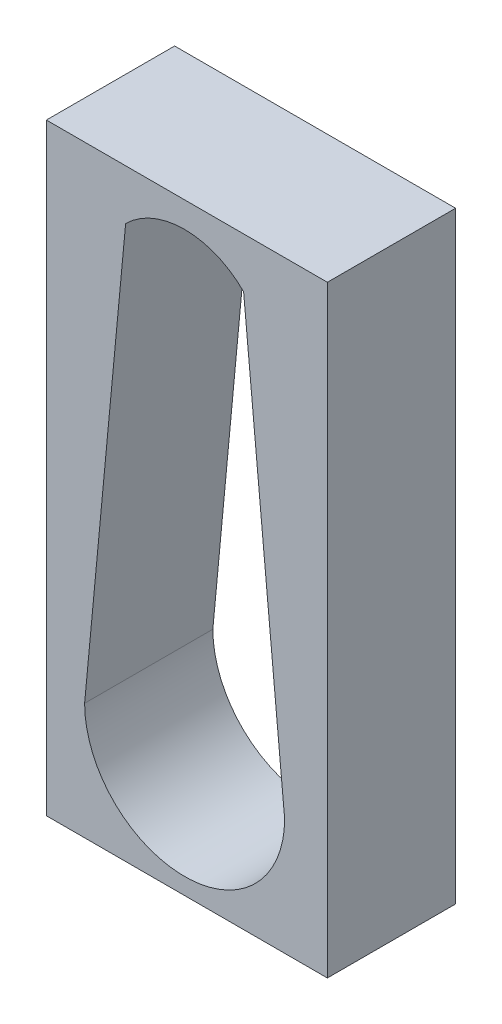
ISO-10303-21;
HEADER;
FILE_DESCRIPTION(('STEP AP214'),'2;1');
FILE_NAME('part.step','',(''),(''),'','','');
FILE_SCHEMA(('AUTOMOTIVE_DESIGN { 1 0 10303 214 1 1 1 1 }'));
ENDSEC;
DATA;
#1=APPLICATION_CONTEXT('core data for automotive mechanical design processes');
#2=APPLICATION_PROTOCOL_DEFINITION('international standard','automotive_design',2000,#1);
#3=PRODUCT_CONTEXT('',#1,'mechanical');
#4=PRODUCT('Part','Part','',(#3));
#5=PRODUCT_RELATED_PRODUCT_CATEGORY('part','',(#4));
#6=PRODUCT_DEFINITION_FORMATION('','',#4);
#7=PRODUCT_DEFINITION_CONTEXT('part definition',#1,'design');
#8=PRODUCT_DEFINITION('design','',#6,#7);
#9=PRODUCT_DEFINITION_SHAPE('','',#8);
#10=(LENGTH_UNIT() NAMED_UNIT(*) SI_UNIT(.MILLI.,.METRE.));
#11=(NAMED_UNIT(*) PLANE_ANGLE_UNIT() SI_UNIT($,.RADIAN.));
#12=(NAMED_UNIT(*) SI_UNIT($,.STERADIAN.) SOLID_ANGLE_UNIT());
#13=UNCERTAINTY_MEASURE_WITH_UNIT(LENGTH_MEASURE(1.E-05),#10,'distance_accuracy_value','');
#14=(GEOMETRIC_REPRESENTATION_CONTEXT(3) GLOBAL_UNCERTAINTY_ASSIGNED_CONTEXT((#13)) GLOBAL_UNIT_ASSIGNED_CONTEXT((#10,
#11,#12)) REPRESENTATION_CONTEXT('',''));
#15=CARTESIAN_POINT('',(0.,0.,0.));
#16=DIRECTION('',(0.,0.,1.));
#17=DIRECTION('',(1.,0.,0.));
#18=AXIS2_PLACEMENT_3D('',#15,#16,#17);
#19=CARTESIAN_POINT('',(0.,0.,5.));
#20=DIRECTION('',(0.,0.,1.));
#21=DIRECTION('',(1.,0.,0.));
#22=AXIS2_PLACEMENT_3D('',#19,#20,#21);
#23=PLANE('',#22);
#24=DIRECTION('',(0.,-1.,0.));
#25=VECTOR('',#24,1.);
#26=CARTESIAN_POINT('',(-5.39006600771874,18.9510857556661,5.));
#27=LINE('',#26,#25);
#28=CARTESIAN_POINT('',(-5.39006600771874,18.9510857556661,5.));
#29=VERTEX_POINT('',#28);
#30=CARTESIAN_POINT('',(-5.39006600771874,-4.54399738258899,5.));
#31=VERTEX_POINT('',#30);
#32=EDGE_CURVE('E159',#29,#31,#27,.T.);
#33=ORIENTED_EDGE('',*,*,#32,.T.);
#34=DIRECTION('',(1.,0.,0.));
#35=VECTOR('',#34,1.);
#36=CARTESIAN_POINT('',(-5.39006600771874,-4.54399738258899,5.));
#37=LINE('',#36,#35);
#38=CARTESIAN_POINT('',(5.56642690625399,-4.54399738258899,5.));
#39=VERTEX_POINT('',#38);
#40=EDGE_CURVE('E163',#31,#39,#37,.T.);
#41=ORIENTED_EDGE('',*,*,#40,.T.);
#42=DIRECTION('',(0.,1.,0.));
#43=VECTOR('',#42,1.);
#44=CARTESIAN_POINT('',(5.56642690625399,18.9510857556661,5.));
#45=LINE('',#44,#43);
#46=CARTESIAN_POINT('',(5.56642690625399,18.9510857556661,5.));
#47=VERTEX_POINT('',#46);
#48=EDGE_CURVE('E167',#39,#47,#45,.T.);
#49=ORIENTED_EDGE('',*,*,#48,.T.);
#50=DIRECTION('',(-1.,0.,0.));
#51=VECTOR('',#50,1.);
#52=CARTESIAN_POINT('',(-5.39006600771874,18.9510857556661,5.));
#53=LINE('',#52,#51);
#54=EDGE_CURVE('E170',#47,#29,#53,.T.);
#55=ORIENTED_EDGE('',*,*,#54,.T.);
#56=EDGE_LOOP('',(#33,#41,#49,#55));
#57=FACE_BOUND('',#56,.T.);
#58=DIRECTION('',(-0.0937035429320522,0.995600143653054,0.));
#59=VECTOR('',#58,1.);
#60=CARTESIAN_POINT('',(3.9,0.,5.));
#61=LINE('',#60,#59);
#62=CARTESIAN_POINT('',(3.9,0.,5.));
#63=VERTEX_POINT('',#62);
#64=CARTESIAN_POINT('',(2.3,17.,5.));
#65=VERTEX_POINT('',#64);
#66=EDGE_CURVE('E120',#63,#65,#61,.T.);
#67=ORIENTED_EDGE('',*,*,#66,.F.);
#68=CARTESIAN_POINT('',(0.,0.,5.));
#69=DIRECTION('',(0.,0.,1.));
#70=DIRECTION('',(1.,0.,0.));
#71=AXIS2_PLACEMENT_3D('',#68,#69,#70);
#72=CIRCLE('',#71,3.9);
#73=CARTESIAN_POINT('',(-3.9,0.,5.));
#74=VERTEX_POINT('',#73);
#75=EDGE_CURVE('E111',#74,#63,#72,.T.);
#76=ORIENTED_EDGE('',*,*,#75,.F.);
#77=DIRECTION('',(-0.0937035429320521,-0.995600143653054,0.));
#78=VECTOR('',#77,1.);
#79=CARTESIAN_POINT('',(-3.9,0.,5.));
#80=LINE('',#79,#78);
#81=CARTESIAN_POINT('',(-2.3,17.,5.));
#82=VERTEX_POINT('',#81);
#83=EDGE_CURVE('E137',#82,#74,#80,.T.);
#84=ORIENTED_EDGE('',*,*,#83,.F.);
#85=CARTESIAN_POINT('',(0.,14.7,5.));
#86=DIRECTION('',(0.,0.,1.));
#87=DIRECTION('',(-1.,0.,0.));
#88=AXIS2_PLACEMENT_3D('',#85,#86,#87);
#89=CIRCLE('',#88,3.25269119345812);
#90=EDGE_CURVE('E133',#65,#82,#89,.T.);
#91=ORIENTED_EDGE('',*,*,#90,.F.);
#92=EDGE_LOOP('',(#67,#76,#84,#91));
#93=FACE_BOUND('',#92,.T.);
#94=ADVANCED_FACE('F45',(#57,#93),#23,.T.);
#95=CARTESIAN_POINT('',(0.,0.,0.));
#96=DIRECTION('',(0.,0.,1.));
#97=DIRECTION('',(1.,0.,0.));
#98=AXIS2_PLACEMENT_3D('',#95,#96,#97);
#99=PLANE('',#98);
#100=DIRECTION('',(0.,-1.,0.));
#101=VECTOR('',#100,1.);
#102=CARTESIAN_POINT('',(-5.39006600771874,18.9510857556661,0.));
#103=LINE('',#102,#101);
#104=CARTESIAN_POINT('',(-5.39006600771874,18.9510857556661,0.));
#105=VERTEX_POINT('',#104);
#106=CARTESIAN_POINT('',(-5.39006600771874,-4.54399738258899,0.));
#107=VERTEX_POINT('',#106);
#108=EDGE_CURVE('E129',#105,#107,#103,.T.);
#109=ORIENTED_EDGE('',*,*,#108,.F.);
#110=DIRECTION('',(-1.,0.,0.));
#111=VECTOR('',#110,1.);
#112=CARTESIAN_POINT('',(-5.39006600771874,18.9510857556661,0.));
#113=LINE('',#112,#111);
#114=CARTESIAN_POINT('',(5.56642690625399,18.9510857556661,0.));
#115=VERTEX_POINT('',#114);
#116=EDGE_CURVE('E164',#115,#105,#113,.T.);
#117=ORIENTED_EDGE('',*,*,#116,.F.);
#118=DIRECTION('',(0.,1.,0.));
#119=VECTOR('',#118,1.);
#120=CARTESIAN_POINT('',(5.56642690625399,18.9510857556661,0.));
#121=LINE('',#120,#119);
#122=CARTESIAN_POINT('',(5.56642690625399,-4.54399738258899,0.));
#123=VERTEX_POINT('',#122);
#124=EDGE_CURVE('E180',#123,#115,#121,.T.);
#125=ORIENTED_EDGE('',*,*,#124,.F.);
#126=DIRECTION('',(1.,0.,0.));
#127=VECTOR('',#126,1.);
#128=CARTESIAN_POINT('',(-5.39006600771874,-4.54399738258899,0.));
#129=LINE('',#128,#127);
#130=EDGE_CURVE('E177',#107,#123,#129,.T.);
#131=ORIENTED_EDGE('',*,*,#130,.F.);
#132=EDGE_LOOP('',(#109,#117,#125,#131));
#133=FACE_BOUND('',#132,.T.);
#134=CARTESIAN_POINT('',(0.,0.,0.));
#135=DIRECTION('',(0.,0.,1.));
#136=DIRECTION('',(1.,0.,0.));
#137=AXIS2_PLACEMENT_3D('',#134,#135,#136);
#138=CIRCLE('',#137,3.9);
#139=CARTESIAN_POINT('',(-3.9,0.,0.));
#140=VERTEX_POINT('',#139);
#141=CARTESIAN_POINT('',(3.9,0.,0.));
#142=VERTEX_POINT('',#141);
#143=EDGE_CURVE('E69',#140,#142,#138,.T.);
#144=ORIENTED_EDGE('',*,*,#143,.T.);
#145=DIRECTION('',(-0.0937035429320522,0.995600143653054,0.));
#146=VECTOR('',#145,1.);
#147=CARTESIAN_POINT('',(3.9,0.,0.));
#148=LINE('',#147,#146);
#149=CARTESIAN_POINT('',(2.3,17.,0.));
#150=VERTEX_POINT('',#149);
#151=EDGE_CURVE('E127',#142,#150,#148,.T.);
#152=ORIENTED_EDGE('',*,*,#151,.T.);
#153=CARTESIAN_POINT('',(0.,14.7,0.));
#154=DIRECTION('',(0.,0.,1.));
#155=DIRECTION('',(-1.,0.,0.));
#156=AXIS2_PLACEMENT_3D('',#153,#154,#155);
#157=CIRCLE('',#156,3.25269119345812);
#158=CARTESIAN_POINT('',(-2.3,17.,0.));
#159=VERTEX_POINT('',#158);
#160=EDGE_CURVE('E146',#150,#159,#157,.T.);
#161=ORIENTED_EDGE('',*,*,#160,.T.);
#162=DIRECTION('',(-0.0937035429320521,-0.995600143653054,0.));
#163=VECTOR('',#162,1.);
#164=CARTESIAN_POINT('',(-3.9,0.,0.));
#165=LINE('',#164,#163);
#166=EDGE_CURVE('E121',#159,#140,#165,.T.);
#167=ORIENTED_EDGE('',*,*,#166,.T.);
#168=EDGE_LOOP('',(#144,#152,#161,#167));
#169=FACE_BOUND('',#168,.T.);
#170=ADVANCED_FACE('F203',(#133,#169),#99,.F.);
#171=CARTESIAN_POINT('',(-5.39006600771874,18.9510857556661,5.));
#172=DIRECTION('',(1.,0.,0.));
#173=DIRECTION('',(0.,0.,-1.));
#174=AXIS2_PLACEMENT_3D('',#171,#172,#173);
#175=PLANE('',#174);
#176=ORIENTED_EDGE('',*,*,#108,.T.);
#177=DIRECTION('',(0.,0.,-1.));
#178=VECTOR('',#177,1.);
#179=CARTESIAN_POINT('',(-5.39006600771874,-4.54399738258899,5.));
#180=LINE('',#179,#178);
#181=EDGE_CURVE('E11',#31,#107,#180,.T.);
#182=ORIENTED_EDGE('',*,*,#181,.F.);
#183=ORIENTED_EDGE('',*,*,#32,.F.);
#184=DIRECTION('',(0.,0.,-1.));
#185=VECTOR('',#184,1.);
#186=CARTESIAN_POINT('',(-5.39006600771874,18.9510857556661,5.));
#187=LINE('',#186,#185);
#188=EDGE_CURVE('E173',#29,#105,#187,.T.);
#189=ORIENTED_EDGE('',*,*,#188,.T.);
#190=EDGE_LOOP('',(#176,#182,#183,#189));
#191=FACE_BOUND('',#190,.T.);
#192=ADVANCED_FACE('F47',(#191),#175,.F.);
#193=CARTESIAN_POINT('',(-5.39006600771874,-4.54399738258899,5.));
#194=DIRECTION('',(0.,1.,0.));
#195=DIRECTION('',(0.,0.,1.));
#196=AXIS2_PLACEMENT_3D('',#193,#194,#195);
#197=PLANE('',#196);
#198=ORIENTED_EDGE('',*,*,#130,.T.);
#199=DIRECTION('',(0.,0.,-1.));
#200=VECTOR('',#199,1.);
#201=CARTESIAN_POINT('',(5.56642690625399,-4.54399738258899,5.));
#202=LINE('',#201,#200);
#203=EDGE_CURVE('E54',#39,#123,#202,.T.);
#204=ORIENTED_EDGE('',*,*,#203,.F.);
#205=ORIENTED_EDGE('',*,*,#40,.F.);
#206=ORIENTED_EDGE('',*,*,#181,.T.);
#207=EDGE_LOOP('',(#198,#204,#205,#206));
#208=FACE_BOUND('',#207,.T.);
#209=ADVANCED_FACE('F213',(#208),#197,.F.);
#210=CARTESIAN_POINT('',(5.56642690625399,18.9510857556661,5.));
#211=DIRECTION('',(-1.,0.,0.));
#212=DIRECTION('',(0.,0.,1.));
#213=AXIS2_PLACEMENT_3D('',#210,#211,#212);
#214=PLANE('',#213);
#215=ORIENTED_EDGE('',*,*,#124,.T.);
#216=DIRECTION('',(0.,0.,-1.));
#217=VECTOR('',#216,1.);
#218=CARTESIAN_POINT('',(5.56642690625399,18.9510857556661,5.));
#219=LINE('',#218,#217);
#220=EDGE_CURVE('E188',#47,#115,#219,.T.);
#221=ORIENTED_EDGE('',*,*,#220,.F.);
#222=ORIENTED_EDGE('',*,*,#48,.F.);
#223=ORIENTED_EDGE('',*,*,#203,.T.);
#224=EDGE_LOOP('',(#215,#221,#222,#223));
#225=FACE_BOUND('',#224,.T.);
#226=ADVANCED_FACE('F197',(#225),#214,.F.);
#227=CARTESIAN_POINT('',(-5.39006600771874,18.9510857556661,5.));
#228=DIRECTION('',(0.,-1.,0.));
#229=DIRECTION('',(0.,0.,-1.));
#230=AXIS2_PLACEMENT_3D('',#227,#228,#229);
#231=PLANE('',#230);
#232=ORIENTED_EDGE('',*,*,#116,.T.);
#233=ORIENTED_EDGE('',*,*,#188,.F.);
#234=ORIENTED_EDGE('',*,*,#54,.F.);
#235=ORIENTED_EDGE('',*,*,#220,.T.);
#236=EDGE_LOOP('',(#232,#233,#234,#235));
#237=FACE_BOUND('',#236,.T.);
#238=ADVANCED_FACE('F207',(#237),#231,.F.);
#239=CARTESIAN_POINT('',(0.,0.,5.));
#240=DIRECTION('',(0.,0.,-1.));
#241=DIRECTION('',(-1.,0.,0.));
#242=AXIS2_PLACEMENT_3D('',#239,#240,#241);
#243=CYLINDRICAL_SURFACE('',#242,3.9);
#244=ORIENTED_EDGE('',*,*,#143,.F.);
#245=DIRECTION('',(0.,0.,-1.));
#246=VECTOR('',#245,1.);
#247=CARTESIAN_POINT('',(-3.9,0.,5.));
#248=LINE('',#247,#246);
#249=EDGE_CURVE('E115',#74,#140,#248,.T.);
#250=ORIENTED_EDGE('',*,*,#249,.F.);
#251=ORIENTED_EDGE('',*,*,#75,.T.);
#252=DIRECTION('',(0.,0.,-1.));
#253=VECTOR('',#252,1.);
#254=CARTESIAN_POINT('',(3.9,0.,5.));
#255=LINE('',#254,#253);
#256=EDGE_CURVE('E114',#63,#142,#255,.T.);
#257=ORIENTED_EDGE('',*,*,#256,.T.);
#258=EDGE_LOOP('',(#244,#250,#251,#257));
#259=FACE_BOUND('',#258,.T.);
#260=ADVANCED_FACE('F113',(#259),#243,.F.);
#261=CARTESIAN_POINT('',(3.9,0.,5.));
#262=DIRECTION('',(-0.995600143653054,-0.0937035429320522,0.));
#263=DIRECTION('',(0.0937035429320522,-0.995600143653054,0.));
#264=AXIS2_PLACEMENT_3D('',#261,#262,#263);
#265=PLANE('',#264);
#266=ORIENTED_EDGE('',*,*,#151,.F.);
#267=ORIENTED_EDGE('',*,*,#256,.F.);
#268=ORIENTED_EDGE('',*,*,#66,.T.);
#269=DIRECTION('',(0.,0.,-1.));
#270=VECTOR('',#269,1.);
#271=CARTESIAN_POINT('',(2.3,17.,5.));
#272=LINE('',#271,#270);
#273=EDGE_CURVE('E130',#65,#150,#272,.T.);
#274=ORIENTED_EDGE('',*,*,#273,.T.);
#275=EDGE_LOOP('',(#266,#267,#268,#274));
#276=FACE_BOUND('',#275,.T.);
#277=ADVANCED_FACE('F124',(#276),#265,.T.);
#278=CARTESIAN_POINT('',(0.,14.7,5.));
#279=DIRECTION('',(0.,0.,-1.));
#280=DIRECTION('',(-1.,0.,0.));
#281=AXIS2_PLACEMENT_3D('',#278,#279,#280);
#282=CYLINDRICAL_SURFACE('',#281,3.25269119345812);
#283=ORIENTED_EDGE('',*,*,#160,.F.);
#284=ORIENTED_EDGE('',*,*,#273,.F.);
#285=ORIENTED_EDGE('',*,*,#90,.T.);
#286=DIRECTION('',(0.,0.,-1.));
#287=VECTOR('',#286,1.);
#288=CARTESIAN_POINT('',(-2.3,17.,5.));
#289=LINE('',#288,#287);
#290=EDGE_CURVE('E61',#82,#159,#289,.T.);
#291=ORIENTED_EDGE('',*,*,#290,.T.);
#292=EDGE_LOOP('',(#283,#284,#285,#291));
#293=FACE_BOUND('',#292,.T.);
#294=ADVANCED_FACE('F236',(#293),#282,.F.);
#295=CARTESIAN_POINT('',(-3.9,0.,5.));
#296=DIRECTION('',(0.995600143653054,-0.0937035429320521,0.));
#297=DIRECTION('',(0.0937035429320521,0.995600143653054,0.));
#298=AXIS2_PLACEMENT_3D('',#295,#296,#297);
#299=PLANE('',#298);
#300=ORIENTED_EDGE('',*,*,#166,.F.);
#301=ORIENTED_EDGE('',*,*,#290,.F.);
#302=ORIENTED_EDGE('',*,*,#83,.T.);
#303=ORIENTED_EDGE('',*,*,#249,.T.);
#304=EDGE_LOOP('',(#300,#301,#302,#303));
#305=FACE_BOUND('',#304,.T.);
#306=ADVANCED_FACE('F240',(#305),#299,.T.);
#307=CLOSED_SHELL('',(#94,#170,#192,#209,#226,#238,#260,#277,#294,#306));
#308=MANIFOLD_SOLID_BREP('B2',#307);
#309=ADVANCED_BREP_SHAPE_REPRESENTATION('',(#18,#308),#14);
#310=SHAPE_DEFINITION_REPRESENTATION(#9,#309);
ENDSEC;
END-ISO-10303-21;
